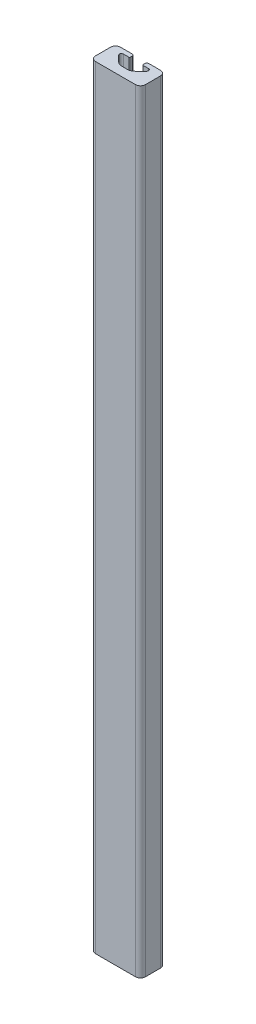
ISO-10303-21;
HEADER;
FILE_DESCRIPTION(('STEP AP214'),'2;1');
FILE_NAME('part.step','',(''),(''),'','','');
FILE_SCHEMA(('AUTOMOTIVE_DESIGN { 1 0 10303 214 1 1 1 1 }'));
ENDSEC;
DATA;
#1=APPLICATION_CONTEXT('core data for automotive mechanical design processes');
#2=APPLICATION_PROTOCOL_DEFINITION('international standard','automotive_design',2000,#1);
#3=PRODUCT_CONTEXT('',#1,'mechanical');
#4=PRODUCT('Part','Part','',(#3));
#5=PRODUCT_RELATED_PRODUCT_CATEGORY('part','',(#4));
#6=PRODUCT_DEFINITION_FORMATION('','',#4);
#7=PRODUCT_DEFINITION_CONTEXT('part definition',#1,'design');
#8=PRODUCT_DEFINITION('design','',#6,#7);
#9=PRODUCT_DEFINITION_SHAPE('','',#8);
#10=(LENGTH_UNIT() NAMED_UNIT(*) SI_UNIT(.MILLI.,.METRE.));
#11=(NAMED_UNIT(*) PLANE_ANGLE_UNIT() SI_UNIT($,.RADIAN.));
#12=(NAMED_UNIT(*) SI_UNIT($,.STERADIAN.) SOLID_ANGLE_UNIT());
#13=UNCERTAINTY_MEASURE_WITH_UNIT(LENGTH_MEASURE(1.E-05),#10,'distance_accuracy_value','');
#14=(GEOMETRIC_REPRESENTATION_CONTEXT(3) GLOBAL_UNCERTAINTY_ASSIGNED_CONTEXT((#13)) GLOBAL_UNIT_ASSIGNED_CONTEXT((#10,
#11,#12)) REPRESENTATION_CONTEXT('',''));
#15=CARTESIAN_POINT('',(0.,0.,0.));
#16=DIRECTION('',(0.,0.,1.));
#17=DIRECTION('',(1.,0.,0.));
#18=AXIS2_PLACEMENT_3D('',#15,#16,#17);
#19=CARTESIAN_POINT('',(4.62499999999888,310.,-9.20000000000226));
#20=DIRECTION('',(0.,-1.,0.));
#21=DIRECTION('',(0.,0.,-1.));
#22=AXIS2_PLACEMENT_3D('',#19,#20,#21);
#23=CYLINDRICAL_SURFACE('',#22,0.799999999997851);
#24=CARTESIAN_POINT('',(4.62499999999888,0.,-9.20000000000226));
#25=DIRECTION('',(0.,1.,0.));
#26=DIRECTION('',(0.,0.,1.));
#27=AXIS2_PLACEMENT_3D('',#24,#25,#26);
#28=CIRCLE('',#27,0.799999999997851);
#29=CARTESIAN_POINT('',(5.42499999999674,0.,-9.20000000000226));
#30=VERTEX_POINT('',#29);
#31=CARTESIAN_POINT('',(4.62499999999661,0.,-10.0000000000001));
#32=VERTEX_POINT('',#31);
#33=EDGE_CURVE('E224',#30,#32,#28,.T.);
#34=ORIENTED_EDGE('',*,*,#33,.T.);
#35=DIRECTION('',(0.,-1.,0.));
#36=VECTOR('',#35,1.);
#37=CARTESIAN_POINT('',(4.62499999999661,310.,-10.0000000000001));
#38=LINE('',#37,#36);
#39=CARTESIAN_POINT('',(4.62499999999661,310.,-10.0000000000001));
#40=VERTEX_POINT('',#39);
#41=EDGE_CURVE('E11',#40,#32,#38,.T.);
#42=ORIENTED_EDGE('',*,*,#41,.F.);
#43=CARTESIAN_POINT('',(4.62499999999888,310.,-9.20000000000226));
#44=DIRECTION('',(0.,1.,0.));
#45=DIRECTION('',(0.,0.,1.));
#46=AXIS2_PLACEMENT_3D('',#43,#44,#45);
#47=CIRCLE('',#46,0.799999999997851);
#48=CARTESIAN_POINT('',(5.42499999999674,310.,-9.20000000000226));
#49=VERTEX_POINT('',#48);
#50=EDGE_CURVE('E270',#49,#40,#47,.T.);
#51=ORIENTED_EDGE('',*,*,#50,.F.);
#52=DIRECTION('',(0.,-1.,0.));
#53=VECTOR('',#52,1.);
#54=CARTESIAN_POINT('',(5.42499999999674,310.,-9.20000000000226));
#55=LINE('',#54,#53);
#56=EDGE_CURVE('E220',#49,#30,#55,.T.);
#57=ORIENTED_EDGE('',*,*,#56,.T.);
#58=EDGE_LOOP('',(#34,#42,#51,#57));
#59=FACE_BOUND('',#58,.T.);
#60=ADVANCED_FACE('F32',(#59),#23,.T.);
#61=CARTESIAN_POINT('',(4.62499999999661,310.,-10.0000000000001));
#62=DIRECTION('',(0.,0.,1.));
#63=DIRECTION('',(1.,0.,0.));
#64=AXIS2_PLACEMENT_3D('',#61,#62,#63);
#65=PLANE('',#64);
#66=DIRECTION('',(-1.,0.,0.));
#67=VECTOR('',#66,1.);
#68=CARTESIAN_POINT('',(4.62499999999661,0.,-10.0000000000001));
#69=LINE('',#68,#67);
#70=CARTESIAN_POINT('',(-6.5746019739521E-12,0.,-10.0000000000001));
#71=VERTEX_POINT('',#70);
#72=EDGE_CURVE('E227',#32,#71,#69,.T.);
#73=ORIENTED_EDGE('',*,*,#72,.T.);
#74=DIRECTION('',(0.,-1.,0.));
#75=VECTOR('',#74,1.);
#76=CARTESIAN_POINT('',(-6.5746019739521E-12,310.,-10.0000000000001));
#77=LINE('',#76,#75);
#78=CARTESIAN_POINT('',(-6.5746019739521E-12,310.,-10.0000000000001));
#79=VERTEX_POINT('',#78);
#80=EDGE_CURVE('E40',#79,#71,#77,.T.);
#81=ORIENTED_EDGE('',*,*,#80,.F.);
#82=DIRECTION('',(-1.,0.,0.));
#83=VECTOR('',#82,1.);
#84=CARTESIAN_POINT('',(4.62499999999661,310.,-10.0000000000001));
#85=LINE('',#84,#83);
#86=EDGE_CURVE('E139',#40,#79,#85,.T.);
#87=ORIENTED_EDGE('',*,*,#86,.F.);
#88=ORIENTED_EDGE('',*,*,#41,.T.);
#89=EDGE_LOOP('',(#73,#81,#87,#88));
#90=FACE_BOUND('',#89,.T.);
#91=ADVANCED_FACE('F408',(#90),#65,.F.);
#92=CARTESIAN_POINT('',(-6.5746019739521E-12,310.,-8.00000000000402));
#93=DIRECTION('',(0.,-1.,0.));
#94=DIRECTION('',(0.,0.,-1.));
#95=AXIS2_PLACEMENT_3D('',#92,#93,#94);
#96=CYLINDRICAL_SURFACE('',#95,1.99999999999608);
#97=CARTESIAN_POINT('',(-6.5746019739521E-12,0.,-8.00000000000402));
#98=DIRECTION('',(0.,1.,0.));
#99=DIRECTION('',(0.,0.,1.));
#100=AXIS2_PLACEMENT_3D('',#97,#98,#99);
#101=CIRCLE('',#100,1.99999999999608);
#102=CARTESIAN_POINT('',(-2.00000000000266,0.,-8.00000000000402));
#103=VERTEX_POINT('',#102);
#104=EDGE_CURVE('E229',#71,#103,#101,.T.);
#105=ORIENTED_EDGE('',*,*,#104,.T.);
#106=DIRECTION('',(0.,-1.,0.));
#107=VECTOR('',#106,1.);
#108=CARTESIAN_POINT('',(-2.00000000000266,310.,-8.00000000000402));
#109=LINE('',#108,#107);
#110=CARTESIAN_POINT('',(-2.00000000000266,310.,-8.00000000000402));
#111=VERTEX_POINT('',#110);
#112=EDGE_CURVE('E325',#111,#103,#109,.T.);
#113=ORIENTED_EDGE('',*,*,#112,.F.);
#114=CARTESIAN_POINT('',(-6.5746019739521E-12,310.,-8.00000000000402));
#115=DIRECTION('',(0.,1.,0.));
#116=DIRECTION('',(0.,0.,1.));
#117=AXIS2_PLACEMENT_3D('',#114,#115,#116);
#118=CIRCLE('',#117,1.99999999999608);
#119=EDGE_CURVE('E333',#79,#111,#118,.T.);
#120=ORIENTED_EDGE('',*,*,#119,.F.);
#121=ORIENTED_EDGE('',*,*,#80,.T.);
#122=EDGE_LOOP('',(#105,#113,#120,#121));
#123=FACE_BOUND('',#122,.T.);
#124=ADVANCED_FACE('F331',(#123),#96,.T.);
#125=CARTESIAN_POINT('',(-2.00000000000266,310.,-8.00000000000402));
#126=DIRECTION('',(1.,0.,0.));
#127=DIRECTION('',(0.,0.,-1.));
#128=AXIS2_PLACEMENT_3D('',#125,#126,#127);
#129=PLANE('',#128);
#130=DIRECTION('',(0.,0.,1.));
#131=VECTOR('',#130,1.);
#132=CARTESIAN_POINT('',(-2.00000000000266,0.,-8.00000000000402));
#133=LINE('',#132,#131);
#134=CARTESIAN_POINT('',(-2.00000000000266,0.,-2.00000000000266));
#135=VERTEX_POINT('',#134);
#136=EDGE_CURVE('E231',#103,#135,#133,.T.);
#137=ORIENTED_EDGE('',*,*,#136,.T.);
#138=DIRECTION('',(0.,-1.,0.));
#139=VECTOR('',#138,1.);
#140=CARTESIAN_POINT('',(-2.00000000000266,310.,-2.00000000000266));
#141=LINE('',#140,#139);
#142=CARTESIAN_POINT('',(-2.00000000000266,310.,-2.00000000000266));
#143=VERTEX_POINT('',#142);
#144=EDGE_CURVE('E322',#143,#135,#141,.T.);
#145=ORIENTED_EDGE('',*,*,#144,.F.);
#146=DIRECTION('',(0.,0.,1.));
#147=VECTOR('',#146,1.);
#148=CARTESIAN_POINT('',(-2.00000000000266,310.,-8.00000000000402));
#149=LINE('',#148,#147);
#150=EDGE_CURVE('E351',#111,#143,#149,.T.);
#151=ORIENTED_EDGE('',*,*,#150,.F.);
#152=ORIENTED_EDGE('',*,*,#112,.T.);
#153=EDGE_LOOP('',(#137,#145,#151,#152));
#154=FACE_BOUND('',#153,.T.);
#155=ADVANCED_FACE('F342',(#154),#129,.F.);
#156=CARTESIAN_POINT('',(0.,310.,-2.00000000000266));
#157=DIRECTION('',(0.,-1.,0.));
#158=DIRECTION('',(0.,0.,-1.));
#159=AXIS2_PLACEMENT_3D('',#156,#157,#158);
#160=CYLINDRICAL_SURFACE('',#159,2.00000000000266);
#161=CARTESIAN_POINT('',(0.,0.,-2.00000000000266));
#162=DIRECTION('',(0.,1.,0.));
#163=DIRECTION('',(0.,0.,1.));
#164=AXIS2_PLACEMENT_3D('',#161,#162,#163);
#165=CIRCLE('',#164,2.00000000000266);
#166=CARTESIAN_POINT('',(0.,0.,0.));
#167=VERTEX_POINT('',#166);
#168=EDGE_CURVE('E233',#135,#167,#165,.T.);
#169=ORIENTED_EDGE('',*,*,#168,.T.);
#170=DIRECTION('',(0.,-1.,0.));
#171=VECTOR('',#170,1.);
#172=CARTESIAN_POINT('',(0.,310.,0.));
#173=LINE('',#172,#171);
#174=CARTESIAN_POINT('',(0.,310.,0.));
#175=VERTEX_POINT('',#174);
#176=EDGE_CURVE('E319',#175,#167,#173,.T.);
#177=ORIENTED_EDGE('',*,*,#176,.F.);
#178=CARTESIAN_POINT('',(0.,310.,-2.00000000000266));
#179=DIRECTION('',(0.,1.,0.));
#180=DIRECTION('',(0.,0.,1.));
#181=AXIS2_PLACEMENT_3D('',#178,#179,#180);
#182=CIRCLE('',#181,2.00000000000266);
#183=EDGE_CURVE('E348',#143,#175,#182,.T.);
#184=ORIENTED_EDGE('',*,*,#183,.F.);
#185=ORIENTED_EDGE('',*,*,#144,.T.);
#186=EDGE_LOOP('',(#169,#177,#184,#185));
#187=FACE_BOUND('',#186,.T.);
#188=ADVANCED_FACE('F346',(#187),#160,.T.);
#189=CARTESIAN_POINT('',(0.,310.,0.));
#190=DIRECTION('',(0.,0.,-1.));
#191=DIRECTION('',(-1.,0.,0.));
#192=AXIS2_PLACEMENT_3D('',#189,#190,#191);
#193=PLANE('',#192);
#194=DIRECTION('',(1.,0.,0.));
#195=VECTOR('',#194,1.);
#196=CARTESIAN_POINT('',(0.,0.,0.));
#197=LINE('',#196,#195);
#198=CARTESIAN_POINT('',(16.0000000000036,0.,0.));
#199=VERTEX_POINT('',#198);
#200=EDGE_CURVE('E235',#167,#199,#197,.T.);
#201=ORIENTED_EDGE('',*,*,#200,.T.);
#202=DIRECTION('',(0.,-1.,0.));
#203=VECTOR('',#202,1.);
#204=CARTESIAN_POINT('',(16.0000000000036,310.,0.));
#205=LINE('',#204,#203);
#206=CARTESIAN_POINT('',(16.0000000000036,310.,0.));
#207=VERTEX_POINT('',#206);
#208=EDGE_CURVE('E316',#207,#199,#205,.T.);
#209=ORIENTED_EDGE('',*,*,#208,.F.);
#210=DIRECTION('',(1.,0.,0.));
#211=VECTOR('',#210,1.);
#212=CARTESIAN_POINT('',(0.,310.,0.));
#213=LINE('',#212,#211);
#214=EDGE_CURVE('E350',#175,#207,#213,.T.);
#215=ORIENTED_EDGE('',*,*,#214,.F.);
#216=ORIENTED_EDGE('',*,*,#176,.T.);
#217=EDGE_LOOP('',(#201,#209,#215,#216));
#218=FACE_BOUND('',#217,.T.);
#219=ADVANCED_FACE('F421',(#218),#193,.F.);
#220=CARTESIAN_POINT('',(16.0000000000036,310.,-1.99999999999836));
#221=DIRECTION('',(0.,-1.,0.));
#222=DIRECTION('',(0.,0.,-1.));
#223=AXIS2_PLACEMENT_3D('',#220,#221,#222);
#224=CYLINDRICAL_SURFACE('',#223,1.99999999999836);
#225=CARTESIAN_POINT('',(16.0000000000036,0.,-1.99999999999836));
#226=DIRECTION('',(0.,1.,0.));
#227=DIRECTION('',(0.,0.,1.));
#228=AXIS2_PLACEMENT_3D('',#225,#226,#227);
#229=CIRCLE('',#228,1.99999999999836);
#230=CARTESIAN_POINT('',(18.000000000002,0.,-1.99999999999836));
#231=VERTEX_POINT('',#230);
#232=EDGE_CURVE('E237',#199,#231,#229,.T.);
#233=ORIENTED_EDGE('',*,*,#232,.T.);
#234=DIRECTION('',(0.,-1.,0.));
#235=VECTOR('',#234,1.);
#236=CARTESIAN_POINT('',(18.000000000002,310.,-1.99999999999836));
#237=LINE('',#236,#235);
#238=CARTESIAN_POINT('',(18.000000000002,310.,-1.99999999999836));
#239=VERTEX_POINT('',#238);
#240=EDGE_CURVE('E313',#239,#231,#237,.T.);
#241=ORIENTED_EDGE('',*,*,#240,.F.);
#242=CARTESIAN_POINT('',(16.0000000000036,310.,-1.99999999999836));
#243=DIRECTION('',(0.,1.,0.));
#244=DIRECTION('',(0.,0.,1.));
#245=AXIS2_PLACEMENT_3D('',#242,#243,#244);
#246=CIRCLE('',#245,1.99999999999836);
#247=EDGE_CURVE('E353',#207,#239,#246,.T.);
#248=ORIENTED_EDGE('',*,*,#247,.F.);
#249=ORIENTED_EDGE('',*,*,#208,.T.);
#250=EDGE_LOOP('',(#233,#241,#248,#249));
#251=FACE_BOUND('',#250,.T.);
#252=ADVANCED_FACE('F424',(#251),#224,.T.);
#253=CARTESIAN_POINT('',(18.000000000002,310.,-1.99999999999836));
#254=DIRECTION('',(-1.,0.,0.));
#255=DIRECTION('',(0.,0.,1.));
#256=AXIS2_PLACEMENT_3D('',#253,#254,#255);
#257=PLANE('',#256);
#258=DIRECTION('',(0.,0.,-1.));
#259=VECTOR('',#258,1.);
#260=CARTESIAN_POINT('',(18.000000000002,0.,-1.99999999999836));
#261=LINE('',#260,#259);
#262=CARTESIAN_POINT('',(18.000000000002,0.,-7.99999999999859));
#263=VERTEX_POINT('',#262);
#264=EDGE_CURVE('E239',#231,#263,#261,.T.);
#265=ORIENTED_EDGE('',*,*,#264,.T.);
#266=DIRECTION('',(0.,-1.,0.));
#267=VECTOR('',#266,1.);
#268=CARTESIAN_POINT('',(18.000000000002,310.,-7.99999999999859));
#269=LINE('',#268,#267);
#270=CARTESIAN_POINT('',(18.000000000002,310.,-7.99999999999859));
#271=VERTEX_POINT('',#270);
#272=EDGE_CURVE('E310',#271,#263,#269,.T.);
#273=ORIENTED_EDGE('',*,*,#272,.F.);
#274=DIRECTION('',(0.,0.,-1.));
#275=VECTOR('',#274,1.);
#276=CARTESIAN_POINT('',(18.000000000002,310.,-1.99999999999836));
#277=LINE('',#276,#275);
#278=EDGE_CURVE('E359',#239,#271,#277,.T.);
#279=ORIENTED_EDGE('',*,*,#278,.F.);
#280=ORIENTED_EDGE('',*,*,#240,.T.);
#281=EDGE_LOOP('',(#265,#273,#279,#280));
#282=FACE_BOUND('',#281,.T.);
#283=ADVANCED_FACE('F428',(#282),#257,.F.);
#284=CARTESIAN_POINT('',(16.0000000000038,310.,-8.00000013530586));
#285=DIRECTION('',(0.,-1.,0.));
#286=DIRECTION('',(0.,0.,-1.));
#287=AXIS2_PLACEMENT_3D('',#284,#285,#286);
#288=CYLINDRICAL_SURFACE('',#287,1.99999999999817);
#289=CARTESIAN_POINT('',(16.0000000000038,0.,-8.00000013530586));
#290=DIRECTION('',(0.,1.,0.));
#291=DIRECTION('',(0.,0.,1.));
#292=AXIS2_PLACEMENT_3D('',#289,#290,#291);
#293=CIRCLE('',#292,1.99999999999817);
#294=CARTESIAN_POINT('',(16.0000000000038,0.,-10.000000135304));
#295=VERTEX_POINT('',#294);
#296=EDGE_CURVE('E241',#263,#295,#293,.T.);
#297=ORIENTED_EDGE('',*,*,#296,.T.);
#298=DIRECTION('',(0.,-1.,0.));
#299=VECTOR('',#298,1.);
#300=CARTESIAN_POINT('',(16.0000000000038,310.,-10.000000135304));
#301=LINE('',#300,#299);
#302=CARTESIAN_POINT('',(16.0000000000038,310.,-10.000000135304));
#303=VERTEX_POINT('',#302);
#304=EDGE_CURVE('E307',#303,#295,#301,.T.);
#305=ORIENTED_EDGE('',*,*,#304,.F.);
#306=CARTESIAN_POINT('',(16.0000000000038,310.,-8.00000013530586));
#307=DIRECTION('',(0.,1.,0.));
#308=DIRECTION('',(0.,0.,1.));
#309=AXIS2_PLACEMENT_3D('',#306,#307,#308);
#310=CIRCLE('',#309,1.99999999999817);
#311=EDGE_CURVE('E361',#271,#303,#310,.T.);
#312=ORIENTED_EDGE('',*,*,#311,.F.);
#313=ORIENTED_EDGE('',*,*,#272,.T.);
#314=EDGE_LOOP('',(#297,#305,#312,#313));
#315=FACE_BOUND('',#314,.T.);
#316=ADVANCED_FACE('F432',(#315),#288,.T.);
#317=CARTESIAN_POINT('',(16.0000000000038,310.,-10.000000135304));
#318=DIRECTION('',(0.,0.,1.));
#319=DIRECTION('',(1.,0.,0.));
#320=AXIS2_PLACEMENT_3D('',#317,#318,#319);
#321=PLANE('',#320);
#322=DIRECTION('',(-1.,0.,0.));
#323=VECTOR('',#322,1.);
#324=CARTESIAN_POINT('',(16.0000000000038,0.,-10.000000135304));
#325=LINE('',#324,#323);
#326=CARTESIAN_POINT('',(11.3749996641149,0.,-10.000000135304));
#327=VERTEX_POINT('',#326);
#328=EDGE_CURVE('E243',#295,#327,#325,.T.);
#329=ORIENTED_EDGE('',*,*,#328,.T.);
#330=DIRECTION('',(0.,-1.,0.));
#331=VECTOR('',#330,1.);
#332=CARTESIAN_POINT('',(11.3749996641149,310.,-10.000000135304));
#333=LINE('',#332,#331);
#334=CARTESIAN_POINT('',(11.3749996641149,310.,-10.000000135304));
#335=VERTEX_POINT('',#334);
#336=EDGE_CURVE('E304',#335,#327,#333,.T.);
#337=ORIENTED_EDGE('',*,*,#336,.F.);
#338=DIRECTION('',(-1.,0.,0.));
#339=VECTOR('',#338,1.);
#340=CARTESIAN_POINT('',(16.0000000000038,310.,-10.000000135304));
#341=LINE('',#340,#339);
#342=EDGE_CURVE('E363',#303,#335,#341,.T.);
#343=ORIENTED_EDGE('',*,*,#342,.F.);
#344=ORIENTED_EDGE('',*,*,#304,.T.);
#345=EDGE_LOOP('',(#329,#337,#343,#344));
#346=FACE_BOUND('',#345,.T.);
#347=ADVANCED_FACE('F436',(#346),#321,.F.);
#348=CARTESIAN_POINT('',(11.3749996641127,310.,-9.20000013530876));
#349=DIRECTION('',(0.,-1.,0.));
#350=DIRECTION('',(0.,0.,-1.));
#351=AXIS2_PLACEMENT_3D('',#348,#349,#350);
#352=CYLINDRICAL_SURFACE('',#351,0.799999999995258);
#353=CARTESIAN_POINT('',(11.3749996641127,0.,-9.20000013530876));
#354=DIRECTION('',(0.,1.,0.));
#355=DIRECTION('',(0.,0.,1.));
#356=AXIS2_PLACEMENT_3D('',#353,#354,#355);
#357=CIRCLE('',#356,0.799999999995258);
#358=CARTESIAN_POINT('',(10.5749996641174,0.,-9.20000013530876));
#359=VERTEX_POINT('',#358);
#360=EDGE_CURVE('E245',#327,#359,#357,.T.);
#361=ORIENTED_EDGE('',*,*,#360,.T.);
#362=DIRECTION('',(0.,-1.,0.));
#363=VECTOR('',#362,1.);
#364=CARTESIAN_POINT('',(10.5749996641174,310.,-9.20000013530876));
#365=LINE('',#364,#363);
#366=CARTESIAN_POINT('',(10.5749996641174,310.,-9.20000013530876));
#367=VERTEX_POINT('',#366);
#368=EDGE_CURVE('E301',#367,#359,#365,.T.);
#369=ORIENTED_EDGE('',*,*,#368,.F.);
#370=CARTESIAN_POINT('',(11.3749996641127,310.,-9.20000013530876));
#371=DIRECTION('',(0.,1.,0.));
#372=DIRECTION('',(0.,0.,1.));
#373=AXIS2_PLACEMENT_3D('',#370,#371,#372);
#374=CIRCLE('',#373,0.799999999995258);
#375=EDGE_CURVE('E365',#335,#367,#374,.T.);
#376=ORIENTED_EDGE('',*,*,#375,.F.);
#377=ORIENTED_EDGE('',*,*,#336,.T.);
#378=EDGE_LOOP('',(#361,#369,#376,#377));
#379=FACE_BOUND('',#378,.T.);
#380=ADVANCED_FACE('F440',(#379),#352,.T.);
#381=CARTESIAN_POINT('',(10.5749996641174,310.,-9.20000013530876));
#382=DIRECTION('',(1.,0.,0.));
#383=DIRECTION('',(0.,0.,-1.));
#384=AXIS2_PLACEMENT_3D('',#381,#382,#383);
#385=PLANE('',#384);
#386=DIRECTION('',(0.,0.,1.));
#387=VECTOR('',#386,1.);
#388=CARTESIAN_POINT('',(10.5749996641174,0.,-9.20000013530876));
#389=LINE('',#388,#387);
#390=CARTESIAN_POINT('',(10.5749996641174,0.,-8.50000089824812));
#391=VERTEX_POINT('',#390);
#392=EDGE_CURVE('E247',#359,#391,#389,.T.);
#393=ORIENTED_EDGE('',*,*,#392,.T.);
#394=DIRECTION('',(0.,-1.,0.));
#395=VECTOR('',#394,1.);
#396=CARTESIAN_POINT('',(10.5749996641174,310.,-8.50000089824812));
#397=LINE('',#396,#395);
#398=CARTESIAN_POINT('',(10.5749996641174,310.,-8.50000089824812));
#399=VERTEX_POINT('',#398);
#400=EDGE_CURVE('E298',#399,#391,#397,.T.);
#401=ORIENTED_EDGE('',*,*,#400,.F.);
#402=DIRECTION('',(0.,0.,1.));
#403=VECTOR('',#402,1.);
#404=CARTESIAN_POINT('',(10.5749996641174,310.,-9.20000013530876));
#405=LINE('',#404,#403);
#406=EDGE_CURVE('E367',#367,#399,#405,.T.);
#407=ORIENTED_EDGE('',*,*,#406,.F.);
#408=ORIENTED_EDGE('',*,*,#368,.T.);
#409=EDGE_LOOP('',(#393,#401,#407,#408));
#410=FACE_BOUND('',#409,.T.);
#411=ADVANCED_FACE('F444',(#410),#385,.F.);
#412=CARTESIAN_POINT('',(10.8749996641165,310.,-8.50000089824812));
#413=DIRECTION('',(0.,-1.,0.));
#414=DIRECTION('',(0.,0.,-1.));
#415=AXIS2_PLACEMENT_3D('',#412,#413,#414);
#416=CYLINDRICAL_SURFACE('',#415,0.299999999999054);
#417=CARTESIAN_POINT('',(10.8749996641165,0.,-8.50000089824812));
#418=DIRECTION('',(0.,1.,0.));
#419=DIRECTION('',(0.,0.,1.));
#420=AXIS2_PLACEMENT_3D('',#417,#418,#419);
#421=CIRCLE('',#420,0.299999999999054);
#422=CARTESIAN_POINT('',(10.8749996100731,0.,-8.20000089824907));
#423=VERTEX_POINT('',#422);
#424=EDGE_CURVE('E249',#391,#423,#421,.T.);
#425=ORIENTED_EDGE('',*,*,#424,.T.);
#426=DIRECTION('',(0.,-1.,0.));
#427=VECTOR('',#426,1.);
#428=CARTESIAN_POINT('',(10.8749996100731,310.,-8.20000089824907));
#429=LINE('',#428,#427);
#430=CARTESIAN_POINT('',(10.8749996100731,310.,-8.20000089824907));
#431=VERTEX_POINT('',#430);
#432=EDGE_CURVE('E295',#431,#423,#429,.T.);
#433=ORIENTED_EDGE('',*,*,#432,.F.);
#434=CARTESIAN_POINT('',(10.8749996641165,310.,-8.50000089824812));
#435=DIRECTION('',(0.,1.,0.));
#436=DIRECTION('',(0.,0.,1.));
#437=AXIS2_PLACEMENT_3D('',#434,#435,#436);
#438=CIRCLE('',#437,0.299999999999054);
#439=EDGE_CURVE('E369',#399,#431,#438,.T.);
#440=ORIENTED_EDGE('',*,*,#439,.F.);
#441=ORIENTED_EDGE('',*,*,#400,.T.);
#442=EDGE_LOOP('',(#425,#433,#440,#441));
#443=FACE_BOUND('',#442,.T.);
#444=ADVANCED_FACE('F448',(#443),#416,.T.);
#445=CARTESIAN_POINT('',(10.8749996100731,310.,-8.20000089824907));
#446=DIRECTION('',(1.80144714688106E-07,0.,-0.999999999999984));
#447=DIRECTION('',(-0.999999999999984,0.,-1.80144714688106E-07));
#448=AXIS2_PLACEMENT_3D('',#445,#446,#447);
#449=PLANE('',#448);
#450=DIRECTION('',(0.999999999999984,0.,1.80144714688106E-07));
#451=VECTOR('',#450,1.);
#452=CARTESIAN_POINT('',(10.8749996100731,0.,-8.20000089824907));
#453=LINE('',#452,#451);
#454=CARTESIAN_POINT('',(13.0441210012792,0.,-8.20000050749331));
#455=VERTEX_POINT('',#454);
#456=EDGE_CURVE('E251',#423,#455,#453,.T.);
#457=ORIENTED_EDGE('',*,*,#456,.T.);
#458=DIRECTION('',(0.,-1.,0.));
#459=VECTOR('',#458,1.);
#460=CARTESIAN_POINT('',(13.0441210012792,310.,-8.20000050749331));
#461=LINE('',#460,#459);
#462=CARTESIAN_POINT('',(13.0441210012792,310.,-8.20000050749331));
#463=VERTEX_POINT('',#462);
#464=EDGE_CURVE('E292',#463,#455,#461,.T.);
#465=ORIENTED_EDGE('',*,*,#464,.F.);
#466=DIRECTION('',(0.999999999999984,0.,1.80144714688106E-07));
#467=VECTOR('',#466,1.);
#468=CARTESIAN_POINT('',(10.8749996100731,310.,-8.20000089824907));
#469=LINE('',#468,#467);
#470=EDGE_CURVE('E371',#431,#463,#469,.T.);
#471=ORIENTED_EDGE('',*,*,#470,.F.);
#472=ORIENTED_EDGE('',*,*,#432,.T.);
#473=EDGE_LOOP('',(#457,#465,#471,#472));
#474=FACE_BOUND('',#473,.T.);
#475=ADVANCED_FACE('F452',(#474),#449,.F.);
#476=CARTESIAN_POINT('',(13.0441208607646,310.,-7.42000031211214));
#477=DIRECTION('',(0.,-1.,0.));
#478=DIRECTION('',(0.,0.,-1.));
#479=AXIS2_PLACEMENT_3D('',#476,#477,#478);
#480=CYLINDRICAL_SURFACE('',#479,0.780000195381185);
#481=CARTESIAN_POINT('',(13.0441208607646,0.,-7.42000031211214));
#482=DIRECTION('',(0.,-1.,0.));
#483=DIRECTION('',(0.,0.,1.));
#484=AXIS2_PLACEMENT_3D('',#481,#482,#483);
#485=CIRCLE('',#484,0.780000195381185);
#486=CARTESIAN_POINT('',(13.5956642882455,0.,-6.86845688463127));
#487=VERTEX_POINT('',#486);
#488=EDGE_CURVE('E253',#455,#487,#485,.T.);
#489=ORIENTED_EDGE('',*,*,#488,.T.);
#490=DIRECTION('',(0.,-1.,0.));
#491=VECTOR('',#490,1.);
#492=CARTESIAN_POINT('',(13.5956642882455,310.,-6.86845688463127));
#493=LINE('',#492,#491);
#494=CARTESIAN_POINT('',(13.5956642882455,310.,-6.86845688463127));
#495=VERTEX_POINT('',#494);
#496=EDGE_CURVE('E289',#495,#487,#493,.T.);
#497=ORIENTED_EDGE('',*,*,#496,.F.);
#498=CARTESIAN_POINT('',(13.0441208607646,310.,-7.42000031211214));
#499=DIRECTION('',(0.,-1.,0.));
#500=DIRECTION('',(0.,0.,1.));
#501=AXIS2_PLACEMENT_3D('',#498,#499,#500);
#502=CIRCLE('',#501,0.780000195381185);
#503=EDGE_CURVE('E373',#463,#495,#502,.T.);
#504=ORIENTED_EDGE('',*,*,#503,.F.);
#505=ORIENTED_EDGE('',*,*,#464,.T.);
#506=EDGE_LOOP('',(#489,#497,#504,#505));
#507=FACE_BOUND('',#506,.T.);
#508=ADVANCED_FACE('F456',(#507),#480,.F.);
#509=CARTESIAN_POINT('',(13.5956642882455,310.,-6.86845688463127));
#510=DIRECTION('',(0.707106781186548,0.,0.707106781186547));
#511=DIRECTION('',(0.707106781186547,0.,-0.707106781186548));
#512=AXIS2_PLACEMENT_3D('',#509,#510,#511);
#513=PLANE('',#512);
#514=DIRECTION('',(-0.707106781186547,0.,0.707106781186548));
#515=VECTOR('',#514,1.);
#516=CARTESIAN_POINT('',(13.5956642882455,0.,-6.86845688463127));
#517=LINE('',#516,#515);
#518=CARTESIAN_POINT('',(11.2558872574563,0.,-4.5286798538421));
#519=VERTEX_POINT('',#518);
#520=EDGE_CURVE('E255',#487,#519,#517,.T.);
#521=ORIENTED_EDGE('',*,*,#520,.T.);
#522=DIRECTION('',(0.,-1.,0.));
#523=VECTOR('',#522,1.);
#524=CARTESIAN_POINT('',(11.2558872574563,310.,-4.5286798538421));
#525=LINE('',#524,#523);
#526=CARTESIAN_POINT('',(11.2558872574563,310.,-4.5286798538421));
#527=VERTEX_POINT('',#526);
#528=EDGE_CURVE('E286',#527,#519,#525,.T.);
#529=ORIENTED_EDGE('',*,*,#528,.F.);
#530=DIRECTION('',(-0.707106781186547,0.,0.707106781186548));
#531=VECTOR('',#530,1.);
#532=CARTESIAN_POINT('',(13.5956642882455,310.,-6.86845688463127));
#533=LINE('',#532,#531);
#534=EDGE_CURVE('E375',#495,#527,#533,.T.);
#535=ORIENTED_EDGE('',*,*,#534,.F.);
#536=ORIENTED_EDGE('',*,*,#496,.T.);
#537=EDGE_LOOP('',(#521,#529,#535,#536));
#538=FACE_BOUND('',#537,.T.);
#539=ADVANCED_FACE('F460',(#538),#513,.F.);
#540=CARTESIAN_POINT('',(9.1345669139011,310.,-6.65000019739668));
#541=DIRECTION('',(0.,-1.,0.));
#542=DIRECTION('',(0.,0.,-1.));
#543=AXIS2_PLACEMENT_3D('',#540,#541,#542);
#544=CYLINDRICAL_SURFACE('',#543,2.99999999999329);
#545=CARTESIAN_POINT('',(9.1345669139011,0.,-6.65000019739668));
#546=DIRECTION('',(0.,-1.,0.));
#547=DIRECTION('',(0.,0.,1.));
#548=AXIS2_PLACEMENT_3D('',#545,#546,#547);
#549=CIRCLE('',#548,2.99999999999329);
#550=CARTESIAN_POINT('',(9.1345669139011,0.,-3.65000019740339));
#551=VERTEX_POINT('',#550);
#552=EDGE_CURVE('E257',#519,#551,#549,.T.);
#553=ORIENTED_EDGE('',*,*,#552,.T.);
#554=DIRECTION('',(0.,-1.,0.));
#555=VECTOR('',#554,1.);
#556=CARTESIAN_POINT('',(9.1345669139011,310.,-3.65000019740339));
#557=LINE('',#556,#555);
#558=CARTESIAN_POINT('',(9.1345669139011,310.,-3.65000019740339));
#559=VERTEX_POINT('',#558);
#560=EDGE_CURVE('E283',#559,#551,#557,.T.);
#561=ORIENTED_EDGE('',*,*,#560,.F.);
#562=CARTESIAN_POINT('',(9.1345669139011,310.,-6.65000019739668));
#563=DIRECTION('',(0.,-1.,0.));
#564=DIRECTION('',(0.,0.,1.));
#565=AXIS2_PLACEMENT_3D('',#562,#563,#564);
#566=CIRCLE('',#565,2.99999999999329);
#567=EDGE_CURVE('E377',#527,#559,#566,.T.);
#568=ORIENTED_EDGE('',*,*,#567,.F.);
#569=ORIENTED_EDGE('',*,*,#528,.T.);
#570=EDGE_LOOP('',(#553,#561,#568,#569));
#571=FACE_BOUND('',#570,.T.);
#572=ADVANCED_FACE('F464',(#571),#544,.F.);
#573=CARTESIAN_POINT('',(9.1345669139011,310.,-3.65000019740339));
#574=DIRECTION('',(0.,0.,1.));
#575=DIRECTION('',(1.,0.,0.));
#576=AXIS2_PLACEMENT_3D('',#573,#574,#575);
#577=PLANE('',#576);
#578=DIRECTION('',(-1.,0.,0.));
#579=VECTOR('',#578,1.);
#580=CARTESIAN_POINT('',(9.1345669139011,0.,-3.65000019740339));
#581=LINE('',#580,#579);
#582=CARTESIAN_POINT('',(6.86543269849353,0.,-3.65000019740339));
#583=VERTEX_POINT('',#582);
#584=EDGE_CURVE('E259',#551,#583,#581,.T.);
#585=ORIENTED_EDGE('',*,*,#584,.T.);
#586=DIRECTION('',(0.,-1.,0.));
#587=VECTOR('',#586,1.);
#588=CARTESIAN_POINT('',(6.86543269849353,310.,-3.65000019740339));
#589=LINE('',#588,#587);
#590=CARTESIAN_POINT('',(6.86543269849353,310.,-3.65000019740339));
#591=VERTEX_POINT('',#590);
#592=EDGE_CURVE('E280',#591,#583,#589,.T.);
#593=ORIENTED_EDGE('',*,*,#592,.F.);
#594=DIRECTION('',(-1.,0.,0.));
#595=VECTOR('',#594,1.);
#596=CARTESIAN_POINT('',(9.1345669139011,310.,-3.65000019740339));
#597=LINE('',#596,#595);
#598=EDGE_CURVE('E379',#559,#591,#597,.T.);
#599=ORIENTED_EDGE('',*,*,#598,.F.);
#600=ORIENTED_EDGE('',*,*,#560,.T.);
#601=EDGE_LOOP('',(#585,#593,#599,#600));
#602=FACE_BOUND('',#601,.T.);
#603=ADVANCED_FACE('F468',(#602),#577,.F.);
#604=CARTESIAN_POINT('',(6.86543269537396,310.,-6.65000019623116));
#605=DIRECTION('',(0.,-1.,0.));
#606=DIRECTION('',(0.,0.,-1.));
#607=AXIS2_PLACEMENT_3D('',#604,#605,#606);
#608=CYLINDRICAL_SURFACE('',#607,2.99999999882777);
#609=CARTESIAN_POINT('',(6.86543269537396,0.,-6.65000019623116));
#610=DIRECTION('',(0.,-1.,0.));
#611=DIRECTION('',(0.,0.,1.));
#612=AXIS2_PLACEMENT_3D('',#609,#610,#611);
#613=CIRCLE('',#612,2.99999999882777);
#614=CARTESIAN_POINT('',(4.74411235264321,0.,-4.52867985350041));
#615=VERTEX_POINT('',#614);
#616=EDGE_CURVE('E261',#583,#615,#613,.T.);
#617=ORIENTED_EDGE('',*,*,#616,.T.);
#618=DIRECTION('',(0.,-1.,0.));
#619=VECTOR('',#618,1.);
#620=CARTESIAN_POINT('',(4.74411235264321,310.,-4.52867985350041));
#621=LINE('',#620,#619);
#622=CARTESIAN_POINT('',(4.74411235264321,310.,-4.52867985350041));
#623=VERTEX_POINT('',#622);
#624=EDGE_CURVE('E277',#623,#615,#621,.T.);
#625=ORIENTED_EDGE('',*,*,#624,.F.);
#626=CARTESIAN_POINT('',(6.86543269537396,310.,-6.65000019623116));
#627=DIRECTION('',(0.,-1.,0.));
#628=DIRECTION('',(0.,0.,1.));
#629=AXIS2_PLACEMENT_3D('',#626,#627,#628);
#630=CIRCLE('',#629,2.99999999882777);
#631=EDGE_CURVE('E381',#591,#623,#630,.T.);
#632=ORIENTED_EDGE('',*,*,#631,.F.);
#633=ORIENTED_EDGE('',*,*,#592,.T.);
#634=EDGE_LOOP('',(#617,#625,#632,#633));
#635=FACE_BOUND('',#634,.T.);
#636=ADVANCED_FACE('F472',(#635),#608,.F.);
#637=CARTESIAN_POINT('',(4.74411235264321,310.,-4.52867985350041));
#638=DIRECTION('',(-0.707106781186548,0.,0.707106781186547));
#639=DIRECTION('',(0.707106781186547,0.,0.707106781186548));
#640=AXIS2_PLACEMENT_3D('',#637,#638,#639);
#641=PLANE('',#640);
#642=DIRECTION('',(-0.707106781186547,0.,-0.707106781186548));
#643=VECTOR('',#642,1.);
#644=CARTESIAN_POINT('',(4.74411235264321,0.,-4.52867985350041));
#645=LINE('',#644,#643);
#646=CARTESIAN_POINT('',(2.40433532317463,0.,-6.86845688296899));
#647=VERTEX_POINT('',#646);
#648=EDGE_CURVE('E263',#615,#647,#645,.T.);
#649=ORIENTED_EDGE('',*,*,#648,.T.);
#650=DIRECTION('',(0.,-1.,0.));
#651=VECTOR('',#650,1.);
#652=CARTESIAN_POINT('',(2.40433532317463,310.,-6.86845688296899));
#653=LINE('',#652,#651);
#654=CARTESIAN_POINT('',(2.40433532317463,310.,-6.86845688296899));
#655=VERTEX_POINT('',#654);
#656=EDGE_CURVE('E274',#655,#647,#653,.T.);
#657=ORIENTED_EDGE('',*,*,#656,.F.);
#658=DIRECTION('',(-0.707106781186547,0.,-0.707106781186548));
#659=VECTOR('',#658,1.);
#660=CARTESIAN_POINT('',(4.74411235264321,310.,-4.52867985350041));
#661=LINE('',#660,#659);
#662=EDGE_CURVE('E383',#623,#655,#661,.T.);
#663=ORIENTED_EDGE('',*,*,#662,.F.);
#664=ORIENTED_EDGE('',*,*,#624,.T.);
#665=EDGE_LOOP('',(#649,#657,#663,#664));
#666=FACE_BOUND('',#665,.T.);
#667=ADVANCED_FACE('F389',(#666),#641,.F.);
#668=CARTESIAN_POINT('',(2.95587861249515,310.,-7.42000017229607));
#669=DIRECTION('',(0.,-1.,0.));
#670=DIRECTION('',(0.,0.,-1.));
#671=AXIS2_PLACEMENT_3D('',#668,#669,#670);
#672=CYLINDRICAL_SURFACE('',#671,0.779999999997592);
#673=CARTESIAN_POINT('',(2.95587861249515,0.,-7.42000017229607));
#674=DIRECTION('',(0.,-1.,0.));
#675=DIRECTION('',(0.,0.,1.));
#676=AXIS2_PLACEMENT_3D('',#673,#674,#675);
#677=CIRCLE('',#676,0.779999999997592);
#678=CARTESIAN_POINT('',(2.95587847089787,0.,-8.20000017229365));
#679=VERTEX_POINT('',#678);
#680=EDGE_CURVE('E265',#647,#679,#677,.T.);
#681=ORIENTED_EDGE('',*,*,#680,.T.);
#682=DIRECTION('',(0.,-1.,0.));
#683=VECTOR('',#682,1.);
#684=CARTESIAN_POINT('',(2.95587847089787,310.,-8.20000017229365));
#685=LINE('',#684,#683);
#686=CARTESIAN_POINT('',(2.95587847089787,310.,-8.20000017229365));
#687=VERTEX_POINT('',#686);
#688=EDGE_CURVE('E215',#687,#679,#685,.T.);
#689=ORIENTED_EDGE('',*,*,#688,.F.);
#690=CARTESIAN_POINT('',(2.95587861249515,310.,-7.42000017229607));
#691=DIRECTION('',(0.,-1.,0.));
#692=DIRECTION('',(0.,0.,1.));
#693=AXIS2_PLACEMENT_3D('',#690,#691,#692);
#694=CIRCLE('',#693,0.779999999997592);
#695=EDGE_CURVE('E206',#655,#687,#694,.T.);
#696=ORIENTED_EDGE('',*,*,#695,.F.);
#697=ORIENTED_EDGE('',*,*,#656,.T.);
#698=EDGE_LOOP('',(#681,#689,#696,#697));
#699=FACE_BOUND('',#698,.T.);
#700=ADVANCED_FACE('F393',(#699),#672,.F.);
#701=CARTESIAN_POINT('',(2.95587847089787,310.,-8.20000017229365));
#702=DIRECTION('',(-1.81534983334809E-07,0.,-0.999999999999983));
#703=DIRECTION('',(-0.999999999999984,0.,1.81534983334809E-07));
#704=AXIS2_PLACEMENT_3D('',#701,#702,#703);
#705=PLANE('',#704);
#706=DIRECTION('',(0.999999999999984,0.,-1.81534983334809E-07));
#707=VECTOR('',#706,1.);
#708=CARTESIAN_POINT('',(2.95587847089787,0.,-8.20000017229365));
#709=LINE('',#708,#707);
#710=CARTESIAN_POINT('',(5.12499985756932,0.,-8.20000056606507));
#711=VERTEX_POINT('',#710);
#712=EDGE_CURVE('E214',#679,#711,#709,.T.);
#713=ORIENTED_EDGE('',*,*,#712,.T.);
#714=DIRECTION('',(0.,-1.,0.));
#715=VECTOR('',#714,1.);
#716=CARTESIAN_POINT('',(5.12499985756932,310.,-8.20000056606507));
#717=LINE('',#716,#715);
#718=CARTESIAN_POINT('',(5.12499985756932,310.,-8.20000056606507));
#719=VERTEX_POINT('',#718);
#720=EDGE_CURVE('E211',#719,#711,#717,.T.);
#721=ORIENTED_EDGE('',*,*,#720,.F.);
#722=DIRECTION('',(0.999999999999984,0.,-1.81534983334809E-07));
#723=VECTOR('',#722,1.);
#724=CARTESIAN_POINT('',(2.95587847089787,310.,-8.20000017229365));
#725=LINE('',#724,#723);
#726=EDGE_CURVE('E200',#687,#719,#725,.T.);
#727=ORIENTED_EDGE('',*,*,#726,.F.);
#728=ORIENTED_EDGE('',*,*,#688,.T.);
#729=EDGE_LOOP('',(#713,#721,#727,#728));
#730=FACE_BOUND('',#729,.T.);
#731=ADVANCED_FACE('F212',(#730),#705,.F.);
#732=CARTESIAN_POINT('',(5.12499980310881,310.,-8.50000076295299));
#733=DIRECTION('',(0.,-1.,0.));
#734=DIRECTION('',(0.,0.,-1.));
#735=AXIS2_PLACEMENT_3D('',#732,#733,#734);
#736=CYLINDRICAL_SURFACE('',#735,0.300000196887924);
#737=CARTESIAN_POINT('',(5.12499980310881,0.,-8.50000076295299));
#738=DIRECTION('',(0.,1.,0.));
#739=DIRECTION('',(0.,0.,1.));
#740=AXIS2_PLACEMENT_3D('',#737,#738,#739);
#741=CIRCLE('',#740,0.300000196887924);
#742=CARTESIAN_POINT('',(5.42499999999674,0.,-8.50000076295299));
#743=VERTEX_POINT('',#742);
#744=EDGE_CURVE('E125',#711,#743,#741,.T.);
#745=ORIENTED_EDGE('',*,*,#744,.T.);
#746=DIRECTION('',(0.,-1.,0.));
#747=VECTOR('',#746,1.);
#748=CARTESIAN_POINT('',(5.42499999999674,310.,-8.50000076295299));
#749=LINE('',#748,#747);
#750=CARTESIAN_POINT('',(5.42499999999674,310.,-8.50000076295299));
#751=VERTEX_POINT('',#750);
#752=EDGE_CURVE('E216',#751,#743,#749,.T.);
#753=ORIENTED_EDGE('',*,*,#752,.F.);
#754=CARTESIAN_POINT('',(5.12499980310881,310.,-8.50000076295299));
#755=DIRECTION('',(0.,1.,0.));
#756=DIRECTION('',(0.,0.,1.));
#757=AXIS2_PLACEMENT_3D('',#754,#755,#756);
#758=CIRCLE('',#757,0.300000196887924);
#759=EDGE_CURVE('E204',#719,#751,#758,.T.);
#760=ORIENTED_EDGE('',*,*,#759,.F.);
#761=ORIENTED_EDGE('',*,*,#720,.T.);
#762=EDGE_LOOP('',(#745,#753,#760,#761));
#763=FACE_BOUND('',#762,.T.);
#764=ADVANCED_FACE('F218',(#763),#736,.T.);
#765=CARTESIAN_POINT('',(5.42499999999674,310.,-8.50000076295299));
#766=DIRECTION('',(-1.,0.,0.));
#767=DIRECTION('',(0.,0.,1.));
#768=AXIS2_PLACEMENT_3D('',#765,#766,#767);
#769=PLANE('',#768);
#770=DIRECTION('',(0.,0.,-1.));
#771=VECTOR('',#770,1.);
#772=CARTESIAN_POINT('',(5.42499999999674,0.,-8.50000076295299));
#773=LINE('',#772,#771);
#774=EDGE_CURVE('E131',#743,#30,#773,.T.);
#775=ORIENTED_EDGE('',*,*,#774,.T.);
#776=ORIENTED_EDGE('',*,*,#56,.F.);
#777=DIRECTION('',(0.,0.,-1.));
#778=VECTOR('',#777,1.);
#779=CARTESIAN_POINT('',(5.42499999999674,310.,-8.50000076295299));
#780=LINE('',#779,#778);
#781=EDGE_CURVE('E48',#751,#49,#780,.T.);
#782=ORIENTED_EDGE('',*,*,#781,.F.);
#783=ORIENTED_EDGE('',*,*,#752,.T.);
#784=EDGE_LOOP('',(#775,#776,#782,#783));
#785=FACE_BOUND('',#784,.T.);
#786=ADVANCED_FACE('F397',(#785),#769,.F.);
#787=CARTESIAN_POINT('',(4.62499999999888,310.,-9.20000000000226));
#788=DIRECTION('',(0.,1.,0.));
#789=DIRECTION('',(0.,0.,1.));
#790=AXIS2_PLACEMENT_3D('',#787,#788,#789);
#791=PLANE('',#790);
#792=ORIENTED_EDGE('',*,*,#50,.T.);
#793=ORIENTED_EDGE('',*,*,#86,.T.);
#794=ORIENTED_EDGE('',*,*,#119,.T.);
#795=ORIENTED_EDGE('',*,*,#150,.T.);
#796=ORIENTED_EDGE('',*,*,#183,.T.);
#797=ORIENTED_EDGE('',*,*,#214,.T.);
#798=ORIENTED_EDGE('',*,*,#247,.T.);
#799=ORIENTED_EDGE('',*,*,#278,.T.);
#800=ORIENTED_EDGE('',*,*,#311,.T.);
#801=ORIENTED_EDGE('',*,*,#342,.T.);
#802=ORIENTED_EDGE('',*,*,#375,.T.);
#803=ORIENTED_EDGE('',*,*,#406,.T.);
#804=ORIENTED_EDGE('',*,*,#439,.T.);
#805=ORIENTED_EDGE('',*,*,#470,.T.);
#806=ORIENTED_EDGE('',*,*,#503,.T.);
#807=ORIENTED_EDGE('',*,*,#534,.T.);
#808=ORIENTED_EDGE('',*,*,#567,.T.);
#809=ORIENTED_EDGE('',*,*,#598,.T.);
#810=ORIENTED_EDGE('',*,*,#631,.T.);
#811=ORIENTED_EDGE('',*,*,#662,.T.);
#812=ORIENTED_EDGE('',*,*,#695,.T.);
#813=ORIENTED_EDGE('',*,*,#726,.T.);
#814=ORIENTED_EDGE('',*,*,#759,.T.);
#815=ORIENTED_EDGE('',*,*,#781,.T.);
#816=EDGE_LOOP('',(#792,#793,#794,#795,#796,#797,#798,#799,#800,#801,#802,#803,#804,#805,#806,
#807,#808,#809,#810,#811,#812,#813,#814,#815));
#817=FACE_BOUND('',#816,.T.);
#818=ADVANCED_FACE('F202',(#817),#791,.T.);
#819=CARTESIAN_POINT('',(4.62499999999888,0.,-9.20000000000226));
#820=DIRECTION('',(0.,1.,0.));
#821=DIRECTION('',(0.,0.,1.));
#822=AXIS2_PLACEMENT_3D('',#819,#820,#821);
#823=PLANE('',#822);
#824=ORIENTED_EDGE('',*,*,#33,.F.);
#825=ORIENTED_EDGE('',*,*,#774,.F.);
#826=ORIENTED_EDGE('',*,*,#744,.F.);
#827=ORIENTED_EDGE('',*,*,#712,.F.);
#828=ORIENTED_EDGE('',*,*,#680,.F.);
#829=ORIENTED_EDGE('',*,*,#648,.F.);
#830=ORIENTED_EDGE('',*,*,#616,.F.);
#831=ORIENTED_EDGE('',*,*,#584,.F.);
#832=ORIENTED_EDGE('',*,*,#552,.F.);
#833=ORIENTED_EDGE('',*,*,#520,.F.);
#834=ORIENTED_EDGE('',*,*,#488,.F.);
#835=ORIENTED_EDGE('',*,*,#456,.F.);
#836=ORIENTED_EDGE('',*,*,#424,.F.);
#837=ORIENTED_EDGE('',*,*,#392,.F.);
#838=ORIENTED_EDGE('',*,*,#360,.F.);
#839=ORIENTED_EDGE('',*,*,#328,.F.);
#840=ORIENTED_EDGE('',*,*,#296,.F.);
#841=ORIENTED_EDGE('',*,*,#264,.F.);
#842=ORIENTED_EDGE('',*,*,#232,.F.);
#843=ORIENTED_EDGE('',*,*,#200,.F.);
#844=ORIENTED_EDGE('',*,*,#168,.F.);
#845=ORIENTED_EDGE('',*,*,#136,.F.);
#846=ORIENTED_EDGE('',*,*,#104,.F.);
#847=ORIENTED_EDGE('',*,*,#72,.F.);
#848=EDGE_LOOP('',(#824,#825,#826,#827,#828,#829,#830,#831,#832,#833,#834,#835,#836,#837,#838,
#839,#840,#841,#842,#843,#844,#845,#846,#847));
#849=FACE_BOUND('',#848,.T.);
#850=ADVANCED_FACE('F337',(#849),#823,.F.);
#851=CLOSED_SHELL('',(#60,#91,#124,#155,#188,#219,#252,#283,#316,#347,#380,#411,#444,#475,#508,
#539,#572,#603,#636,#667,#700,#731,#764,#786,#818,#850));
#852=MANIFOLD_SOLID_BREP('B2',#851);
#853=ADVANCED_BREP_SHAPE_REPRESENTATION('',(#18,#852),#14);
#854=SHAPE_DEFINITION_REPRESENTATION(#9,#853);
ENDSEC;
END-ISO-10303-21;
